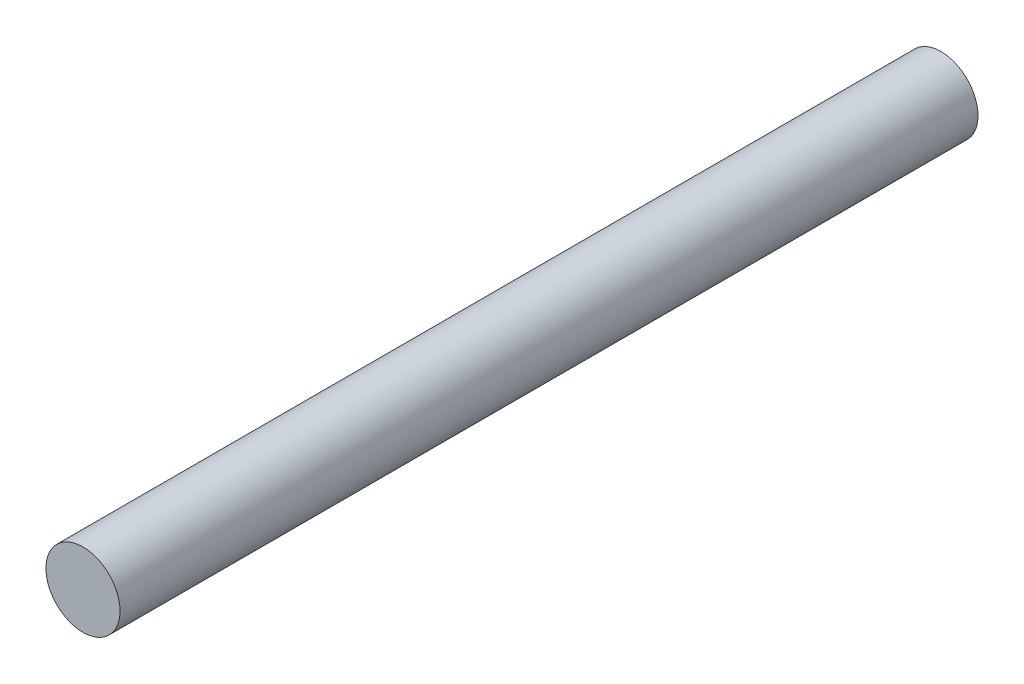
ISO-10303-21;
HEADER;
FILE_DESCRIPTION(('STEP AP214'),'2;1');
FILE_NAME('part.step','',(''),(''),'','','');
FILE_SCHEMA(('AUTOMOTIVE_DESIGN { 1 0 10303 214 1 1 1 1 }'));
ENDSEC;
DATA;
#1=APPLICATION_CONTEXT('core data for automotive mechanical design processes');
#2=APPLICATION_PROTOCOL_DEFINITION('international standard','automotive_design',2000,#1);
#3=PRODUCT_CONTEXT('',#1,'mechanical');
#4=PRODUCT('Part','Part','',(#3));
#5=PRODUCT_RELATED_PRODUCT_CATEGORY('part','',(#4));
#6=PRODUCT_DEFINITION_FORMATION('','',#4);
#7=PRODUCT_DEFINITION_CONTEXT('part definition',#1,'design');
#8=PRODUCT_DEFINITION('design','',#6,#7);
#9=PRODUCT_DEFINITION_SHAPE('','',#8);
#10=(LENGTH_UNIT() NAMED_UNIT(*) SI_UNIT(.MILLI.,.METRE.));
#11=(NAMED_UNIT(*) PLANE_ANGLE_UNIT() SI_UNIT($,.RADIAN.));
#12=(NAMED_UNIT(*) SI_UNIT($,.STERADIAN.) SOLID_ANGLE_UNIT());
#13=UNCERTAINTY_MEASURE_WITH_UNIT(LENGTH_MEASURE(1.E-05),#10,'distance_accuracy_value','');
#14=(GEOMETRIC_REPRESENTATION_CONTEXT(3) GLOBAL_UNCERTAINTY_ASSIGNED_CONTEXT((#13)) GLOBAL_UNIT_ASSIGNED_CONTEXT((#10,
#11,#12)) REPRESENTATION_CONTEXT('',''));
#15=CARTESIAN_POINT('',(0.,0.,0.));
#16=DIRECTION('',(0.,0.,1.));
#17=DIRECTION('',(1.,0.,0.));
#18=AXIS2_PLACEMENT_3D('',#15,#16,#17);
#19=CARTESIAN_POINT('',(0.,0.,139.));
#20=DIRECTION('',(0.,0.,-1.));
#21=DIRECTION('',(-1.,0.,0.));
#22=AXIS2_PLACEMENT_3D('',#19,#20,#21);
#23=CYLINDRICAL_SURFACE('',#22,6.);
#24=CARTESIAN_POINT('',(0.,0.,139.));
#25=DIRECTION('',(0.,0.,1.));
#26=DIRECTION('',(1.,0.,0.));
#27=AXIS2_PLACEMENT_3D('',#24,#25,#26);
#28=CIRCLE('',#27,6.);
#29=CARTESIAN_POINT('',(6.,0.,139.));
#30=VERTEX_POINT('',#29);
#31=EDGE_CURVE('E10',#30,#30,#28,.T.);
#32=ORIENTED_EDGE('',*,*,#31,.F.);
#33=EDGE_LOOP('',(#32));
#34=FACE_BOUND('',#33,.T.);
#35=CARTESIAN_POINT('',(0.,0.,0.));
#36=DIRECTION('',(0.,0.,1.));
#37=DIRECTION('',(1.,0.,0.));
#38=AXIS2_PLACEMENT_3D('',#35,#36,#37);
#39=CIRCLE('',#38,6.);
#40=CARTESIAN_POINT('',(6.,0.,0.));
#41=VERTEX_POINT('',#40);
#42=EDGE_CURVE('E36',#41,#41,#39,.T.);
#43=ORIENTED_EDGE('',*,*,#42,.T.);
#44=EDGE_LOOP('',(#43));
#45=FACE_BOUND('',#44,.T.);
#46=ADVANCED_FACE('F33',(#34,#45),#23,.T.);
#47=CARTESIAN_POINT('',(0.,0.,139.));
#48=DIRECTION('',(0.,0.,1.));
#49=DIRECTION('',(1.,0.,0.));
#50=AXIS2_PLACEMENT_3D('',#47,#48,#49);
#51=PLANE('',#50);
#52=ORIENTED_EDGE('',*,*,#31,.T.);
#53=EDGE_LOOP('',(#52));
#54=FACE_BOUND('',#53,.T.);
#55=ADVANCED_FACE('F48',(#54),#51,.T.);
#56=CARTESIAN_POINT('',(0.,0.,0.));
#57=DIRECTION('',(0.,0.,1.));
#58=DIRECTION('',(1.,0.,0.));
#59=AXIS2_PLACEMENT_3D('',#56,#57,#58);
#60=PLANE('',#59);
#61=ORIENTED_EDGE('',*,*,#42,.F.);
#62=EDGE_LOOP('',(#61));
#63=FACE_BOUND('',#62,.T.);
#64=ADVANCED_FACE('F46',(#63),#60,.F.);
#65=CLOSED_SHELL('',(#46,#55,#64));
#66=MANIFOLD_SOLID_BREP('B2',#65);
#67=ADVANCED_BREP_SHAPE_REPRESENTATION('',(#18,#66),#14);
#68=SHAPE_DEFINITION_REPRESENTATION(#9,#67);
ENDSEC;
END-ISO-10303-21;
